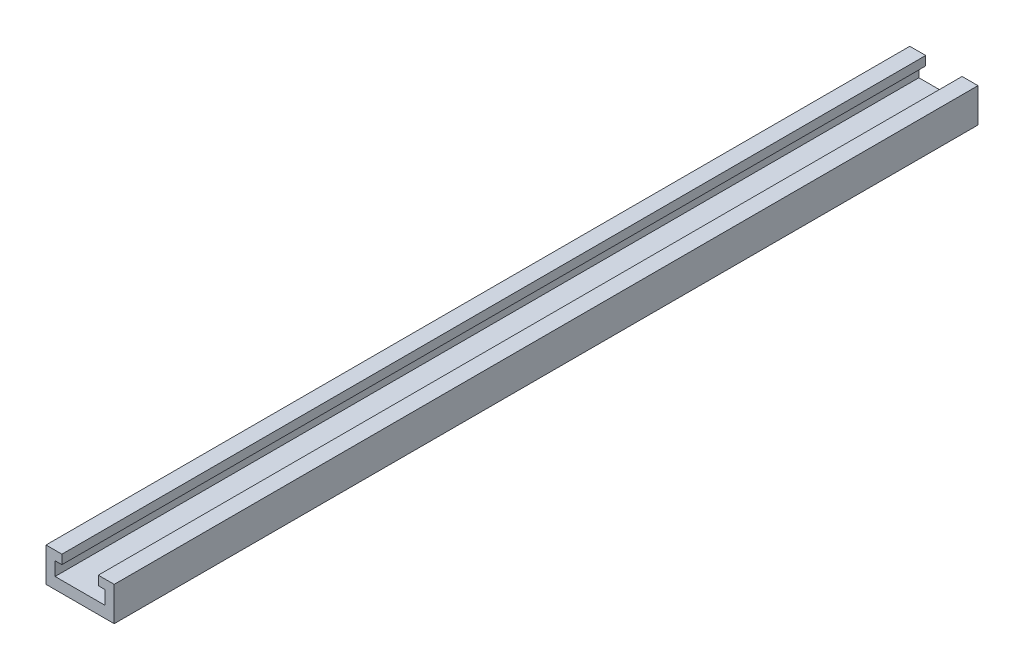
ISO-10303-21;
HEADER;
FILE_DESCRIPTION(('STEP AP214'),'2;1');
FILE_NAME('part.step','',(''),(''),'','','');
FILE_SCHEMA(('AUTOMOTIVE_DESIGN { 1 0 10303 214 1 1 1 1 }'));
ENDSEC;
DATA;
#1=APPLICATION_CONTEXT('core data for automotive mechanical design processes');
#2=APPLICATION_PROTOCOL_DEFINITION('international standard','automotive_design',2000,#1);
#3=PRODUCT_CONTEXT('',#1,'mechanical');
#4=PRODUCT('Part','Part','',(#3));
#5=PRODUCT_RELATED_PRODUCT_CATEGORY('part','',(#4));
#6=PRODUCT_DEFINITION_FORMATION('','',#4);
#7=PRODUCT_DEFINITION_CONTEXT('part definition',#1,'design');
#8=PRODUCT_DEFINITION('design','',#6,#7);
#9=PRODUCT_DEFINITION_SHAPE('','',#8);
#10=(LENGTH_UNIT() NAMED_UNIT(*) SI_UNIT(.MILLI.,.METRE.));
#11=(NAMED_UNIT(*) PLANE_ANGLE_UNIT() SI_UNIT($,.RADIAN.));
#12=(NAMED_UNIT(*) SI_UNIT($,.STERADIAN.) SOLID_ANGLE_UNIT());
#13=UNCERTAINTY_MEASURE_WITH_UNIT(LENGTH_MEASURE(1.E-05),#10,'distance_accuracy_value','');
#14=(GEOMETRIC_REPRESENTATION_CONTEXT(3) GLOBAL_UNCERTAINTY_ASSIGNED_CONTEXT((#13)) GLOBAL_UNIT_ASSIGNED_CONTEXT((#10,
#11,#12)) REPRESENTATION_CONTEXT('',''));
#15=CARTESIAN_POINT('',(0.,0.,0.));
#16=DIRECTION('',(0.,0.,1.));
#17=DIRECTION('',(1.,0.,0.));
#18=AXIS2_PLACEMENT_3D('',#15,#16,#17);
#19=CARTESIAN_POINT('',(0.,0.,120.65));
#20=DIRECTION('',(1.,0.,0.));
#21=DIRECTION('',(0.,0.,-1.));
#22=AXIS2_PLACEMENT_3D('',#19,#20,#21);
#23=PLANE('',#22);
#24=DIRECTION('',(0.,-1.,0.));
#25=VECTOR('',#24,1.);
#26=CARTESIAN_POINT('',(0.,0.,-120.65));
#27=LINE('',#26,#25);
#28=CARTESIAN_POINT('',(0.,9.525,-120.65));
#29=VERTEX_POINT('',#28);
#30=CARTESIAN_POINT('',(0.,0.,-120.65));
#31=VERTEX_POINT('',#30);
#32=EDGE_CURVE('E156',#29,#31,#27,.T.);
#33=ORIENTED_EDGE('',*,*,#32,.T.);
#34=DIRECTION('',(0.,0.,-1.));
#35=VECTOR('',#34,1.);
#36=CARTESIAN_POINT('',(0.,0.,120.65));
#37=LINE('',#36,#35);
#38=CARTESIAN_POINT('',(0.,0.,120.65));
#39=VERTEX_POINT('',#38);
#40=EDGE_CURVE('E11',#39,#31,#37,.T.);
#41=ORIENTED_EDGE('',*,*,#40,.F.);
#42=DIRECTION('',(0.,-1.,0.));
#43=VECTOR('',#42,1.);
#44=CARTESIAN_POINT('',(0.,0.,120.65));
#45=LINE('',#44,#43);
#46=CARTESIAN_POINT('',(0.,9.525,120.65));
#47=VERTEX_POINT('',#46);
#48=EDGE_CURVE('E178',#47,#39,#45,.T.);
#49=ORIENTED_EDGE('',*,*,#48,.F.);
#50=DIRECTION('',(0.,0.,-1.));
#51=VECTOR('',#50,1.);
#52=CARTESIAN_POINT('',(0.,9.525,120.65));
#53=LINE('',#52,#51);
#54=EDGE_CURVE('E152',#47,#29,#53,.T.);
#55=ORIENTED_EDGE('',*,*,#54,.T.);
#56=EDGE_LOOP('',(#33,#41,#49,#55));
#57=FACE_BOUND('',#56,.T.);
#58=ADVANCED_FACE('F35',(#57),#23,.F.);
#59=CARTESIAN_POINT('',(0.,0.,120.65));
#60=DIRECTION('',(0.,1.,0.));
#61=DIRECTION('',(0.,0.,1.));
#62=AXIS2_PLACEMENT_3D('',#59,#60,#61);
#63=PLANE('',#62);
#64=DIRECTION('',(1.,0.,0.));
#65=VECTOR('',#64,1.);
#66=CARTESIAN_POINT('',(0.,0.,-120.65));
#67=LINE('',#66,#65);
#68=CARTESIAN_POINT('',(19.05,0.,-120.65));
#69=VERTEX_POINT('',#68);
#70=EDGE_CURVE('E159',#31,#69,#67,.T.);
#71=ORIENTED_EDGE('',*,*,#70,.T.);
#72=DIRECTION('',(0.,0.,-1.));
#73=VECTOR('',#72,1.);
#74=CARTESIAN_POINT('',(19.05,0.,120.65));
#75=LINE('',#74,#73);
#76=CARTESIAN_POINT('',(19.05,0.,120.65));
#77=VERTEX_POINT('',#76);
#78=EDGE_CURVE('E43',#77,#69,#75,.T.);
#79=ORIENTED_EDGE('',*,*,#78,.F.);
#80=DIRECTION('',(1.,0.,0.));
#81=VECTOR('',#80,1.);
#82=CARTESIAN_POINT('',(0.,0.,120.65));
#83=LINE('',#82,#81);
#84=EDGE_CURVE('E106',#39,#77,#83,.T.);
#85=ORIENTED_EDGE('',*,*,#84,.F.);
#86=ORIENTED_EDGE('',*,*,#40,.T.);
#87=EDGE_LOOP('',(#71,#79,#85,#86));
#88=FACE_BOUND('',#87,.T.);
#89=ADVANCED_FACE('F259',(#88),#63,.F.);
#90=CARTESIAN_POINT('',(19.05,0.,120.65));
#91=DIRECTION('',(-1.,0.,0.));
#92=DIRECTION('',(0.,-1.,0.));
#93=AXIS2_PLACEMENT_3D('',#90,#91,#92);
#94=PLANE('',#93);
#95=DIRECTION('',(0.,1.,0.));
#96=VECTOR('',#95,1.);
#97=CARTESIAN_POINT('',(19.05,0.,-120.65));
#98=LINE('',#97,#96);
#99=CARTESIAN_POINT('',(19.05,9.525,-120.65));
#100=VERTEX_POINT('',#99);
#101=EDGE_CURVE('E161',#69,#100,#98,.T.);
#102=ORIENTED_EDGE('',*,*,#101,.T.);
#103=DIRECTION('',(0.,0.,-1.));
#104=VECTOR('',#103,1.);
#105=CARTESIAN_POINT('',(19.05,9.525,120.65));
#106=LINE('',#105,#104);
#107=CARTESIAN_POINT('',(19.05,9.525,120.65));
#108=VERTEX_POINT('',#107);
#109=EDGE_CURVE('E200',#108,#100,#106,.T.);
#110=ORIENTED_EDGE('',*,*,#109,.F.);
#111=DIRECTION('',(0.,1.,0.));
#112=VECTOR('',#111,1.);
#113=CARTESIAN_POINT('',(19.05,0.,120.65));
#114=LINE('',#113,#112);
#115=EDGE_CURVE('E208',#77,#108,#114,.T.);
#116=ORIENTED_EDGE('',*,*,#115,.F.);
#117=ORIENTED_EDGE('',*,*,#78,.T.);
#118=EDGE_LOOP('',(#102,#110,#116,#117));
#119=FACE_BOUND('',#118,.T.);
#120=ADVANCED_FACE('F206',(#119),#94,.F.);
#121=CARTESIAN_POINT('',(14.605,9.525,120.65));
#122=DIRECTION('',(0.,-1.,0.));
#123=DIRECTION('',(0.,0.,-1.));
#124=AXIS2_PLACEMENT_3D('',#121,#122,#123);
#125=PLANE('',#124);
#126=DIRECTION('',(-1.,0.,0.));
#127=VECTOR('',#126,1.);
#128=CARTESIAN_POINT('',(14.605,9.525,-120.65));
#129=LINE('',#128,#127);
#130=CARTESIAN_POINT('',(14.605,9.525,-120.65));
#131=VERTEX_POINT('',#130);
#132=EDGE_CURVE('E163',#100,#131,#129,.T.);
#133=ORIENTED_EDGE('',*,*,#132,.T.);
#134=DIRECTION('',(0.,0.,-1.));
#135=VECTOR('',#134,1.);
#136=CARTESIAN_POINT('',(14.605,9.525,120.65));
#137=LINE('',#136,#135);
#138=CARTESIAN_POINT('',(14.605,9.525,120.65));
#139=VERTEX_POINT('',#138);
#140=EDGE_CURVE('E197',#139,#131,#137,.T.);
#141=ORIENTED_EDGE('',*,*,#140,.F.);
#142=DIRECTION('',(-1.,0.,0.));
#143=VECTOR('',#142,1.);
#144=CARTESIAN_POINT('',(14.605,9.525,120.65));
#145=LINE('',#144,#143);
#146=EDGE_CURVE('E226',#108,#139,#145,.T.);
#147=ORIENTED_EDGE('',*,*,#146,.F.);
#148=ORIENTED_EDGE('',*,*,#109,.T.);
#149=EDGE_LOOP('',(#133,#141,#147,#148));
#150=FACE_BOUND('',#149,.T.);
#151=ADVANCED_FACE('F217',(#150),#125,.F.);
#152=CARTESIAN_POINT('',(14.605,9.525,120.65));
#153=DIRECTION('',(1.,0.,0.));
#154=DIRECTION('',(0.,0.,-1.));
#155=AXIS2_PLACEMENT_3D('',#152,#153,#154);
#156=PLANE('',#155);
#157=DIRECTION('',(0.,-1.,0.));
#158=VECTOR('',#157,1.);
#159=CARTESIAN_POINT('',(14.605,9.525,-120.65));
#160=LINE('',#159,#158);
#161=CARTESIAN_POINT('',(14.605,6.985,-120.65));
#162=VERTEX_POINT('',#161);
#163=EDGE_CURVE('E165',#131,#162,#160,.T.);
#164=ORIENTED_EDGE('',*,*,#163,.T.);
#165=DIRECTION('',(0.,0.,-1.));
#166=VECTOR('',#165,1.);
#167=CARTESIAN_POINT('',(14.605,6.985,120.65));
#168=LINE('',#167,#166);
#169=CARTESIAN_POINT('',(14.605,6.985,120.65));
#170=VERTEX_POINT('',#169);
#171=EDGE_CURVE('E194',#170,#162,#168,.T.);
#172=ORIENTED_EDGE('',*,*,#171,.F.);
#173=DIRECTION('',(0.,-1.,0.));
#174=VECTOR('',#173,1.);
#175=CARTESIAN_POINT('',(14.605,9.525,120.65));
#176=LINE('',#175,#174);
#177=EDGE_CURVE('E223',#139,#170,#176,.T.);
#178=ORIENTED_EDGE('',*,*,#177,.F.);
#179=ORIENTED_EDGE('',*,*,#140,.T.);
#180=EDGE_LOOP('',(#164,#172,#178,#179));
#181=FACE_BOUND('',#180,.T.);
#182=ADVANCED_FACE('F221',(#181),#156,.F.);
#183=CARTESIAN_POINT('',(14.605,6.985,120.65));
#184=DIRECTION('',(0.,1.,0.));
#185=DIRECTION('',(0.,0.,1.));
#186=AXIS2_PLACEMENT_3D('',#183,#184,#185);
#187=PLANE('',#186);
#188=DIRECTION('',(1.,0.,0.));
#189=VECTOR('',#188,1.);
#190=CARTESIAN_POINT('',(14.605,6.985,-120.65));
#191=LINE('',#190,#189);
#192=CARTESIAN_POINT('',(16.51,6.985,-120.65));
#193=VERTEX_POINT('',#192);
#194=EDGE_CURVE('E167',#162,#193,#191,.T.);
#195=ORIENTED_EDGE('',*,*,#194,.T.);
#196=DIRECTION('',(0.,0.,-1.));
#197=VECTOR('',#196,1.);
#198=CARTESIAN_POINT('',(16.51,6.985,120.65));
#199=LINE('',#198,#197);
#200=CARTESIAN_POINT('',(16.51,6.985,120.65));
#201=VERTEX_POINT('',#200);
#202=EDGE_CURVE('E191',#201,#193,#199,.T.);
#203=ORIENTED_EDGE('',*,*,#202,.F.);
#204=DIRECTION('',(1.,0.,0.));
#205=VECTOR('',#204,1.);
#206=CARTESIAN_POINT('',(14.605,6.985,120.65));
#207=LINE('',#206,#205);
#208=EDGE_CURVE('E225',#170,#201,#207,.T.);
#209=ORIENTED_EDGE('',*,*,#208,.F.);
#210=ORIENTED_EDGE('',*,*,#171,.T.);
#211=EDGE_LOOP('',(#195,#203,#209,#210));
#212=FACE_BOUND('',#211,.T.);
#213=ADVANCED_FACE('F272',(#212),#187,.F.);
#214=CARTESIAN_POINT('',(16.51,6.985,120.65));
#215=DIRECTION('',(1.,0.,0.));
#216=DIRECTION('',(0.,0.,-1.));
#217=AXIS2_PLACEMENT_3D('',#214,#215,#216);
#218=PLANE('',#217);
#219=DIRECTION('',(0.,-1.,0.));
#220=VECTOR('',#219,1.);
#221=CARTESIAN_POINT('',(16.51,6.985,-120.65));
#222=LINE('',#221,#220);
#223=CARTESIAN_POINT('',(16.51,3.175,-120.65));
#224=VERTEX_POINT('',#223);
#225=EDGE_CURVE('E169',#193,#224,#222,.T.);
#226=ORIENTED_EDGE('',*,*,#225,.T.);
#227=DIRECTION('',(0.,0.,-1.));
#228=VECTOR('',#227,1.);
#229=CARTESIAN_POINT('',(16.51,3.175,120.65));
#230=LINE('',#229,#228);
#231=CARTESIAN_POINT('',(16.51,3.175,120.65));
#232=VERTEX_POINT('',#231);
#233=EDGE_CURVE('E188',#232,#224,#230,.T.);
#234=ORIENTED_EDGE('',*,*,#233,.F.);
#235=DIRECTION('',(0.,-1.,0.));
#236=VECTOR('',#235,1.);
#237=CARTESIAN_POINT('',(16.51,6.985,120.65));
#238=LINE('',#237,#236);
#239=EDGE_CURVE('E228',#201,#232,#238,.T.);
#240=ORIENTED_EDGE('',*,*,#239,.F.);
#241=ORIENTED_EDGE('',*,*,#202,.T.);
#242=EDGE_LOOP('',(#226,#234,#240,#241));
#243=FACE_BOUND('',#242,.T.);
#244=ADVANCED_FACE('F275',(#243),#218,.F.);
#245=CARTESIAN_POINT('',(2.54,3.175,120.65));
#246=DIRECTION('',(0.,-1.,0.));
#247=DIRECTION('',(0.,0.,-1.));
#248=AXIS2_PLACEMENT_3D('',#245,#246,#247);
#249=PLANE('',#248);
#250=DIRECTION('',(-1.,0.,0.));
#251=VECTOR('',#250,1.);
#252=CARTESIAN_POINT('',(2.54,3.175,-120.65));
#253=LINE('',#252,#251);
#254=CARTESIAN_POINT('',(2.54,3.175,-120.65));
#255=VERTEX_POINT('',#254);
#256=EDGE_CURVE('E171',#224,#255,#253,.T.);
#257=ORIENTED_EDGE('',*,*,#256,.T.);
#258=DIRECTION('',(0.,0.,-1.));
#259=VECTOR('',#258,1.);
#260=CARTESIAN_POINT('',(2.54,3.175,120.65));
#261=LINE('',#260,#259);
#262=CARTESIAN_POINT('',(2.54,3.175,120.65));
#263=VERTEX_POINT('',#262);
#264=EDGE_CURVE('E185',#263,#255,#261,.T.);
#265=ORIENTED_EDGE('',*,*,#264,.F.);
#266=DIRECTION('',(-1.,0.,0.));
#267=VECTOR('',#266,1.);
#268=CARTESIAN_POINT('',(2.54,3.175,120.65));
#269=LINE('',#268,#267);
#270=EDGE_CURVE('E234',#232,#263,#269,.T.);
#271=ORIENTED_EDGE('',*,*,#270,.F.);
#272=ORIENTED_EDGE('',*,*,#233,.T.);
#273=EDGE_LOOP('',(#257,#265,#271,#272));
#274=FACE_BOUND('',#273,.T.);
#275=ADVANCED_FACE('F240',(#274),#249,.F.);
#276=CARTESIAN_POINT('',(2.54,6.985,120.65));
#277=DIRECTION('',(-1.,0.,0.));
#278=DIRECTION('',(0.,-1.,0.));
#279=AXIS2_PLACEMENT_3D('',#276,#277,#278);
#280=PLANE('',#279);
#281=DIRECTION('',(0.,1.,0.));
#282=VECTOR('',#281,1.);
#283=CARTESIAN_POINT('',(2.54,6.985,-120.65));
#284=LINE('',#283,#282);
#285=CARTESIAN_POINT('',(2.54,6.985,-120.65));
#286=VERTEX_POINT('',#285);
#287=EDGE_CURVE('E173',#255,#286,#284,.T.);
#288=ORIENTED_EDGE('',*,*,#287,.T.);
#289=DIRECTION('',(0.,0.,-1.));
#290=VECTOR('',#289,1.);
#291=CARTESIAN_POINT('',(2.54,6.985,120.65));
#292=LINE('',#291,#290);
#293=CARTESIAN_POINT('',(2.54,6.985,120.65));
#294=VERTEX_POINT('',#293);
#295=EDGE_CURVE('E147',#294,#286,#292,.T.);
#296=ORIENTED_EDGE('',*,*,#295,.F.);
#297=DIRECTION('',(0.,1.,0.));
#298=VECTOR('',#297,1.);
#299=CARTESIAN_POINT('',(2.54,6.985,120.65));
#300=LINE('',#299,#298);
#301=EDGE_CURVE('E137',#263,#294,#300,.T.);
#302=ORIENTED_EDGE('',*,*,#301,.F.);
#303=ORIENTED_EDGE('',*,*,#264,.T.);
#304=EDGE_LOOP('',(#288,#296,#302,#303));
#305=FACE_BOUND('',#304,.T.);
#306=ADVANCED_FACE('F244',(#305),#280,.F.);
#307=CARTESIAN_POINT('',(4.445,6.985,120.65));
#308=DIRECTION('',(0.,1.,0.));
#309=DIRECTION('',(0.,0.,1.));
#310=AXIS2_PLACEMENT_3D('',#307,#308,#309);
#311=PLANE('',#310);
#312=DIRECTION('',(1.,0.,0.));
#313=VECTOR('',#312,1.);
#314=CARTESIAN_POINT('',(4.445,6.985,-120.65));
#315=LINE('',#314,#313);
#316=CARTESIAN_POINT('',(4.445,6.985,-120.65));
#317=VERTEX_POINT('',#316);
#318=EDGE_CURVE('E145',#286,#317,#315,.T.);
#319=ORIENTED_EDGE('',*,*,#318,.T.);
#320=DIRECTION('',(0.,0.,-1.));
#321=VECTOR('',#320,1.);
#322=CARTESIAN_POINT('',(4.445,6.985,120.65));
#323=LINE('',#322,#321);
#324=CARTESIAN_POINT('',(4.445,6.985,120.65));
#325=VERTEX_POINT('',#324);
#326=EDGE_CURVE('E142',#325,#317,#323,.T.);
#327=ORIENTED_EDGE('',*,*,#326,.F.);
#328=DIRECTION('',(1.,0.,0.));
#329=VECTOR('',#328,1.);
#330=CARTESIAN_POINT('',(4.445,6.985,120.65));
#331=LINE('',#330,#329);
#332=EDGE_CURVE('E131',#294,#325,#331,.T.);
#333=ORIENTED_EDGE('',*,*,#332,.F.);
#334=ORIENTED_EDGE('',*,*,#295,.T.);
#335=EDGE_LOOP('',(#319,#327,#333,#334));
#336=FACE_BOUND('',#335,.T.);
#337=ADVANCED_FACE('F143',(#336),#311,.F.);
#338=CARTESIAN_POINT('',(4.445,9.525,120.65));
#339=DIRECTION('',(-1.,0.,0.));
#340=DIRECTION('',(0.,0.,1.));
#341=AXIS2_PLACEMENT_3D('',#338,#339,#340);
#342=PLANE('',#341);
#343=DIRECTION('',(0.,1.,0.));
#344=VECTOR('',#343,1.);
#345=CARTESIAN_POINT('',(4.445,9.525,-120.65));
#346=LINE('',#345,#344);
#347=CARTESIAN_POINT('',(4.445,9.525,-120.65));
#348=VERTEX_POINT('',#347);
#349=EDGE_CURVE('E92',#317,#348,#346,.T.);
#350=ORIENTED_EDGE('',*,*,#349,.T.);
#351=DIRECTION('',(0.,0.,-1.));
#352=VECTOR('',#351,1.);
#353=CARTESIAN_POINT('',(4.445,9.525,120.65));
#354=LINE('',#353,#352);
#355=CARTESIAN_POINT('',(4.445,9.525,120.65));
#356=VERTEX_POINT('',#355);
#357=EDGE_CURVE('E148',#356,#348,#354,.T.);
#358=ORIENTED_EDGE('',*,*,#357,.F.);
#359=DIRECTION('',(0.,1.,0.));
#360=VECTOR('',#359,1.);
#361=CARTESIAN_POINT('',(4.445,9.525,120.65));
#362=LINE('',#361,#360);
#363=EDGE_CURVE('E135',#325,#356,#362,.T.);
#364=ORIENTED_EDGE('',*,*,#363,.F.);
#365=ORIENTED_EDGE('',*,*,#326,.T.);
#366=EDGE_LOOP('',(#350,#358,#364,#365));
#367=FACE_BOUND('',#366,.T.);
#368=ADVANCED_FACE('F150',(#367),#342,.F.);
#369=CARTESIAN_POINT('',(0.,9.525,120.65));
#370=DIRECTION('',(0.,-1.,0.));
#371=DIRECTION('',(0.,0.,-1.));
#372=AXIS2_PLACEMENT_3D('',#369,#370,#371);
#373=PLANE('',#372);
#374=DIRECTION('',(-1.,0.,0.));
#375=VECTOR('',#374,1.);
#376=CARTESIAN_POINT('',(0.,9.525,-120.65));
#377=LINE('',#376,#375);
#378=EDGE_CURVE('E98',#348,#29,#377,.T.);
#379=ORIENTED_EDGE('',*,*,#378,.T.);
#380=ORIENTED_EDGE('',*,*,#54,.F.);
#381=DIRECTION('',(-1.,0.,0.));
#382=VECTOR('',#381,1.);
#383=CARTESIAN_POINT('',(0.,9.525,120.65));
#384=LINE('',#383,#382);
#385=EDGE_CURVE('E51',#356,#47,#384,.T.);
#386=ORIENTED_EDGE('',*,*,#385,.F.);
#387=ORIENTED_EDGE('',*,*,#357,.T.);
#388=EDGE_LOOP('',(#379,#380,#386,#387));
#389=FACE_BOUND('',#388,.T.);
#390=ADVANCED_FACE('F248',(#389),#373,.F.);
#391=CARTESIAN_POINT('',(0.,0.,120.65));
#392=DIRECTION('',(0.,0.,-1.));
#393=DIRECTION('',(-1.,0.,0.));
#394=AXIS2_PLACEMENT_3D('',#391,#392,#393);
#395=PLANE('',#394);
#396=ORIENTED_EDGE('',*,*,#48,.T.);
#397=ORIENTED_EDGE('',*,*,#84,.T.);
#398=ORIENTED_EDGE('',*,*,#115,.T.);
#399=ORIENTED_EDGE('',*,*,#146,.T.);
#400=ORIENTED_EDGE('',*,*,#177,.T.);
#401=ORIENTED_EDGE('',*,*,#208,.T.);
#402=ORIENTED_EDGE('',*,*,#239,.T.);
#403=ORIENTED_EDGE('',*,*,#270,.T.);
#404=ORIENTED_EDGE('',*,*,#301,.T.);
#405=ORIENTED_EDGE('',*,*,#332,.T.);
#406=ORIENTED_EDGE('',*,*,#363,.T.);
#407=ORIENTED_EDGE('',*,*,#385,.T.);
#408=EDGE_LOOP('',(#396,#397,#398,#399,#400,#401,#402,#403,#404,#405,#406,#407));
#409=FACE_BOUND('',#408,.T.);
#410=ADVANCED_FACE('F133',(#409),#395,.F.);
#411=CARTESIAN_POINT('',(0.,0.,-120.65));
#412=DIRECTION('',(0.,0.,-1.));
#413=DIRECTION('',(-1.,0.,0.));
#414=AXIS2_PLACEMENT_3D('',#411,#412,#413);
#415=PLANE('',#414);
#416=ORIENTED_EDGE('',*,*,#32,.F.);
#417=ORIENTED_EDGE('',*,*,#378,.F.);
#418=ORIENTED_EDGE('',*,*,#349,.F.);
#419=ORIENTED_EDGE('',*,*,#318,.F.);
#420=ORIENTED_EDGE('',*,*,#287,.F.);
#421=ORIENTED_EDGE('',*,*,#256,.F.);
#422=ORIENTED_EDGE('',*,*,#225,.F.);
#423=ORIENTED_EDGE('',*,*,#194,.F.);
#424=ORIENTED_EDGE('',*,*,#163,.F.);
#425=ORIENTED_EDGE('',*,*,#132,.F.);
#426=ORIENTED_EDGE('',*,*,#101,.F.);
#427=ORIENTED_EDGE('',*,*,#70,.F.);
#428=EDGE_LOOP('',(#416,#417,#418,#419,#420,#421,#422,#423,#424,#425,#426,#427));
#429=FACE_BOUND('',#428,.T.);
#430=ADVANCED_FACE('F212',(#429),#415,.T.);
#431=CLOSED_SHELL('',(#58,#89,#120,#151,#182,#213,#244,#275,#306,#337,#368,#390,#410,#430));
#432=MANIFOLD_SOLID_BREP('B2',#431);
#433=ADVANCED_BREP_SHAPE_REPRESENTATION('',(#18,#432),#14);
#434=SHAPE_DEFINITION_REPRESENTATION(#9,#433);
ENDSEC;
END-ISO-10303-21;
